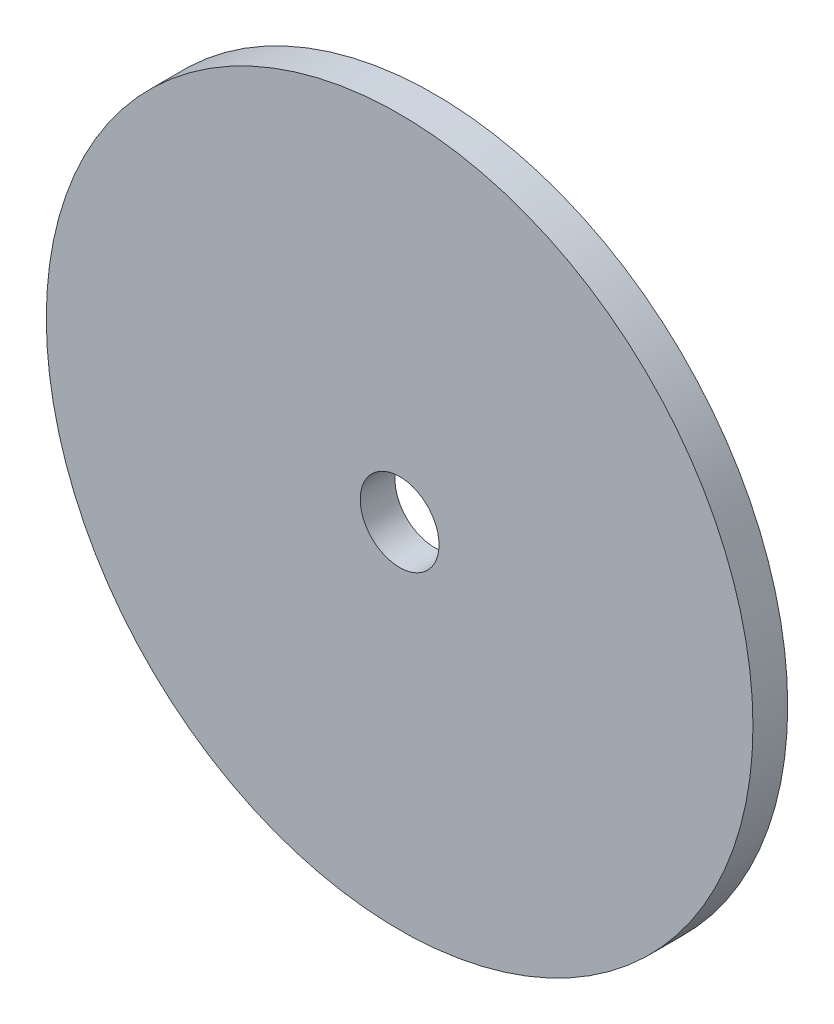
ISO-10303-21;
HEADER;
FILE_DESCRIPTION(('STEP AP214'),'2;1');
FILE_NAME('part.step','',(''),(''),'','','');
FILE_SCHEMA(('AUTOMOTIVE_DESIGN { 1 0 10303 214 1 1 1 1 }'));
ENDSEC;
DATA;
#1=APPLICATION_CONTEXT('core data for automotive mechanical design processes');
#2=APPLICATION_PROTOCOL_DEFINITION('international standard','automotive_design',2000,#1);
#3=PRODUCT_CONTEXT('',#1,'mechanical');
#4=PRODUCT('Part','Part','',(#3));
#5=PRODUCT_RELATED_PRODUCT_CATEGORY('part','',(#4));
#6=PRODUCT_DEFINITION_FORMATION('','',#4);
#7=PRODUCT_DEFINITION_CONTEXT('part definition',#1,'design');
#8=PRODUCT_DEFINITION('design','',#6,#7);
#9=PRODUCT_DEFINITION_SHAPE('','',#8);
#10=(LENGTH_UNIT() NAMED_UNIT(*) SI_UNIT(.MILLI.,.METRE.));
#11=(NAMED_UNIT(*) PLANE_ANGLE_UNIT() SI_UNIT($,.RADIAN.));
#12=(NAMED_UNIT(*) SI_UNIT($,.STERADIAN.) SOLID_ANGLE_UNIT());
#13=UNCERTAINTY_MEASURE_WITH_UNIT(LENGTH_MEASURE(1.E-05),#10,'distance_accuracy_value','');
#14=(GEOMETRIC_REPRESENTATION_CONTEXT(3) GLOBAL_UNCERTAINTY_ASSIGNED_CONTEXT((#13)) GLOBAL_UNIT_ASSIGNED_CONTEXT((#10,
#11,#12)) REPRESENTATION_CONTEXT('',''));
#15=CARTESIAN_POINT('',(0.,0.,0.));
#16=DIRECTION('',(0.,0.,1.));
#17=DIRECTION('',(1.,0.,0.));
#18=AXIS2_PLACEMENT_3D('',#15,#16,#17);
#19=CARTESIAN_POINT('',(0.,0.,3.));
#20=DIRECTION('',(0.,0.,1.));
#21=DIRECTION('',(1.,0.,0.));
#22=AXIS2_PLACEMENT_3D('',#19,#20,#21);
#23=PLANE('',#22);
#24=CARTESIAN_POINT('',(0.,0.,3.));
#25=DIRECTION('',(0.,0.,1.));
#26=DIRECTION('',(1.,0.,0.));
#27=AXIS2_PLACEMENT_3D('',#24,#25,#26);
#28=CIRCLE('',#27,30.5);
#29=CARTESIAN_POINT('',(30.5,0.,3.));
#30=VERTEX_POINT('',#29);
#31=EDGE_CURVE('E10',#30,#30,#28,.T.);
#32=ORIENTED_EDGE('',*,*,#31,.T.);
#33=EDGE_LOOP('',(#32));
#34=FACE_BOUND('',#33,.T.);
#35=CARTESIAN_POINT('',(0.,0.,3.));
#36=DIRECTION('',(0.,0.,1.));
#37=DIRECTION('',(1.,0.,0.));
#38=AXIS2_PLACEMENT_3D('',#35,#36,#37);
#39=CIRCLE('',#38,3.39999999999999);
#40=CARTESIAN_POINT('',(3.39999999999996,0.,3.));
#41=VERTEX_POINT('',#40);
#42=EDGE_CURVE('E41',#41,#41,#39,.T.);
#43=ORIENTED_EDGE('',*,*,#42,.F.);
#44=EDGE_LOOP('',(#43));
#45=FACE_BOUND('',#44,.T.);
#46=ADVANCED_FACE('F30',(#34,#45),#23,.T.);
#47=CARTESIAN_POINT('',(0.,0.,0.));
#48=DIRECTION('',(0.,0.,1.));
#49=DIRECTION('',(1.,0.,0.));
#50=AXIS2_PLACEMENT_3D('',#47,#48,#49);
#51=PLANE('',#50);
#52=CARTESIAN_POINT('',(0.,0.,0.));
#53=DIRECTION('',(0.,0.,1.));
#54=DIRECTION('',(1.,0.,0.));
#55=AXIS2_PLACEMENT_3D('',#52,#53,#54);
#56=CIRCLE('',#55,30.5);
#57=CARTESIAN_POINT('',(30.5,0.,0.));
#58=VERTEX_POINT('',#57);
#59=EDGE_CURVE('E34',#58,#58,#56,.T.);
#60=ORIENTED_EDGE('',*,*,#59,.F.);
#61=EDGE_LOOP('',(#60));
#62=FACE_BOUND('',#61,.T.);
#63=CARTESIAN_POINT('',(0.,0.,0.));
#64=DIRECTION('',(0.,0.,1.));
#65=DIRECTION('',(1.,0.,0.));
#66=AXIS2_PLACEMENT_3D('',#63,#64,#65);
#67=CIRCLE('',#66,3.39999999999999);
#68=CARTESIAN_POINT('',(3.39999999999996,0.,0.));
#69=VERTEX_POINT('',#68);
#70=EDGE_CURVE('E43',#69,#69,#67,.T.);
#71=ORIENTED_EDGE('',*,*,#70,.T.);
#72=EDGE_LOOP('',(#71));
#73=FACE_BOUND('',#72,.T.);
#74=ADVANCED_FACE('F53',(#62,#73),#51,.F.);
#75=CARTESIAN_POINT('',(0.,0.,3.));
#76=DIRECTION('',(0.,0.,-1.));
#77=DIRECTION('',(-1.,0.,0.));
#78=AXIS2_PLACEMENT_3D('',#75,#76,#77);
#79=CYLINDRICAL_SURFACE('',#78,30.5);
#80=ORIENTED_EDGE('',*,*,#31,.F.);
#81=EDGE_LOOP('',(#80));
#82=FACE_BOUND('',#81,.T.);
#83=ORIENTED_EDGE('',*,*,#59,.T.);
#84=EDGE_LOOP('',(#83));
#85=FACE_BOUND('',#84,.T.);
#86=ADVANCED_FACE('F32',(#82,#85),#79,.T.);
#87=CARTESIAN_POINT('',(0.,0.,3.));
#88=DIRECTION('',(0.,0.,-1.));
#89=DIRECTION('',(-1.,0.,0.));
#90=AXIS2_PLACEMENT_3D('',#87,#88,#89);
#91=CYLINDRICAL_SURFACE('',#90,3.39999999999999);
#92=ORIENTED_EDGE('',*,*,#42,.T.);
#93=EDGE_LOOP('',(#92));
#94=FACE_BOUND('',#93,.T.);
#95=ORIENTED_EDGE('',*,*,#70,.F.);
#96=EDGE_LOOP('',(#95));
#97=FACE_BOUND('',#96,.T.);
#98=ADVANCED_FACE('F49',(#94,#97),#91,.F.);
#99=CLOSED_SHELL('',(#46,#74,#86,#98));
#100=MANIFOLD_SOLID_BREP('B2',#99);
#101=ADVANCED_BREP_SHAPE_REPRESENTATION('',(#18,#100),#14);
#102=SHAPE_DEFINITION_REPRESENTATION(#9,#101);
ENDSEC;
END-ISO-10303-21;
